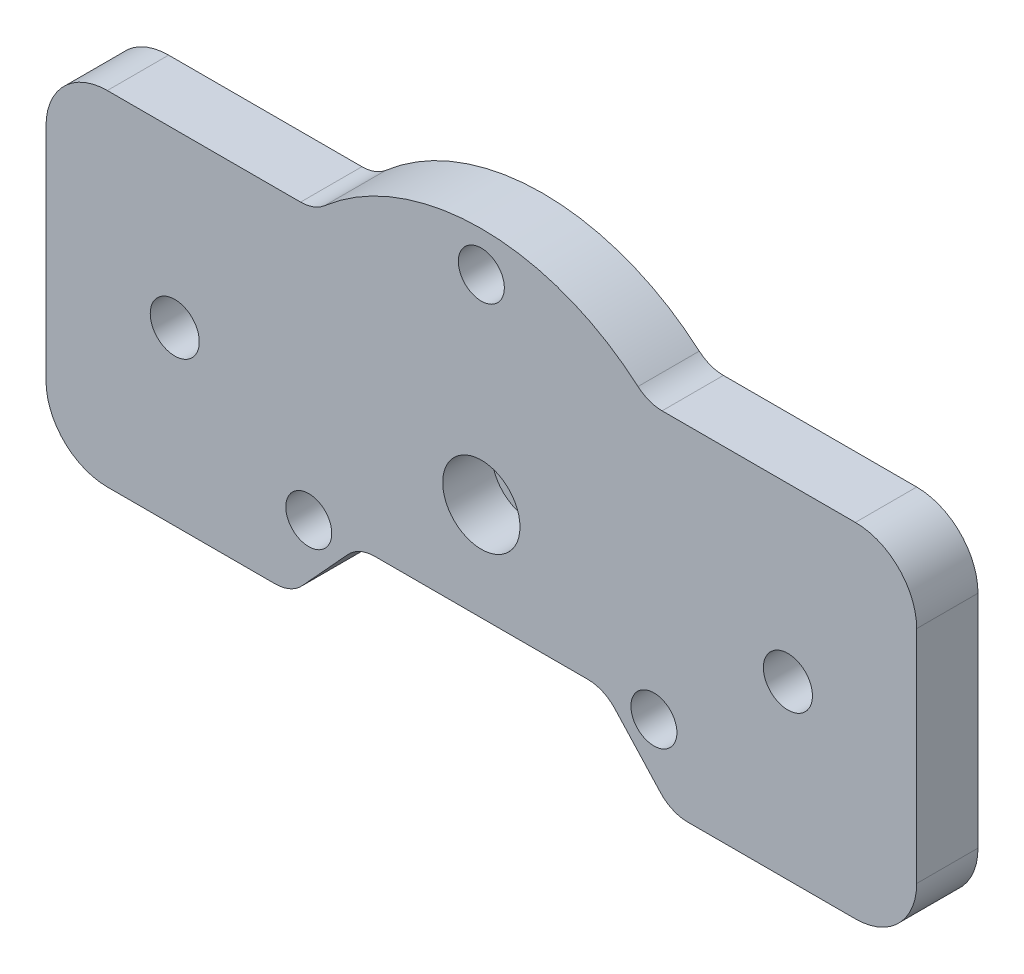
ISO-10303-21;
HEADER;
FILE_DESCRIPTION(('STEP AP214'),'2;1');
FILE_NAME('part.step','',(''),(''),'','','');
FILE_SCHEMA(('AUTOMOTIVE_DESIGN { 1 0 10303 214 1 1 1 1 }'));
ENDSEC;
DATA;
#1=APPLICATION_CONTEXT('core data for automotive mechanical design processes');
#2=APPLICATION_PROTOCOL_DEFINITION('international standard','automotive_design',2000,#1);
#3=PRODUCT_CONTEXT('',#1,'mechanical');
#4=PRODUCT('Part','Part','',(#3));
#5=PRODUCT_RELATED_PRODUCT_CATEGORY('part','',(#4));
#6=PRODUCT_DEFINITION_FORMATION('','',#4);
#7=PRODUCT_DEFINITION_CONTEXT('part definition',#1,'design');
#8=PRODUCT_DEFINITION('design','',#6,#7);
#9=PRODUCT_DEFINITION_SHAPE('','',#8);
#10=(LENGTH_UNIT() NAMED_UNIT(*) SI_UNIT(.MILLI.,.METRE.));
#11=(NAMED_UNIT(*) PLANE_ANGLE_UNIT() SI_UNIT($,.RADIAN.));
#12=(NAMED_UNIT(*) SI_UNIT($,.STERADIAN.) SOLID_ANGLE_UNIT());
#13=UNCERTAINTY_MEASURE_WITH_UNIT(LENGTH_MEASURE(1.E-05),#10,'distance_accuracy_value','');
#14=(GEOMETRIC_REPRESENTATION_CONTEXT(3) GLOBAL_UNCERTAINTY_ASSIGNED_CONTEXT((#13)) GLOBAL_UNIT_ASSIGNED_CONTEXT((#10,
#11,#12)) REPRESENTATION_CONTEXT('',''));
#15=CARTESIAN_POINT('',(0.,0.,0.));
#16=DIRECTION('',(0.,0.,1.));
#17=DIRECTION('',(1.,0.,0.));
#18=AXIS2_PLACEMENT_3D('',#15,#16,#17);
#19=CARTESIAN_POINT('',(35.5,14.,5.));
#20=DIRECTION('',(0.,0.,-1.));
#21=DIRECTION('',(-1.,0.,0.));
#22=AXIS2_PLACEMENT_3D('',#19,#20,#21);
#23=CYLINDRICAL_SURFACE('',#22,1.25);
#24=CARTESIAN_POINT('',(35.5,14.,0.));
#25=DIRECTION('',(0.,0.,1.));
#26=DIRECTION('',(1.,0.,0.));
#27=AXIS2_PLACEMENT_3D('',#24,#25,#26);
#28=CIRCLE('',#27,1.25);
#29=CARTESIAN_POINT('',(36.75,14.,0.));
#30=VERTEX_POINT('',#29);
#31=EDGE_CURVE('E351',#30,#30,#28,.T.);
#32=ORIENTED_EDGE('',*,*,#31,.F.);
#33=EDGE_LOOP('',(#32));
#34=FACE_BOUND('',#33,.T.);
#35=CARTESIAN_POINT('',(35.5,14.,1.));
#36=DIRECTION('',(0.,0.,1.));
#37=DIRECTION('',(1.,0.,0.));
#38=AXIS2_PLACEMENT_3D('',#35,#36,#37);
#39=CIRCLE('',#38,1.25);
#40=CARTESIAN_POINT('',(36.75,14.,1.));
#41=VERTEX_POINT('',#40);
#42=EDGE_CURVE('E38',#41,#41,#39,.T.);
#43=ORIENTED_EDGE('',*,*,#42,.T.);
#44=EDGE_LOOP('',(#43));
#45=FACE_BOUND('',#44,.T.);
#46=ADVANCED_FACE('F34',(#34,#45),#23,.F.);
#47=CARTESIAN_POINT('',(35.5,14.,5.));
#48=DIRECTION('',(0.,0.,1.));
#49=DIRECTION('',(1.,0.,0.));
#50=AXIS2_PLACEMENT_3D('',#47,#48,#49);
#51=PLANE('',#50);
#52=CARTESIAN_POINT('',(60.5,14.,5.));
#53=DIRECTION('',(0.,0.,-1.));
#54=DIRECTION('',(-1.,0.,0.));
#55=AXIS2_PLACEMENT_3D('',#52,#53,#54);
#56=CIRCLE('',#55,2.);
#57=CARTESIAN_POINT('',(58.5,14.,5.));
#58=VERTEX_POINT('',#57);
#59=EDGE_CURVE('E668',#58,#58,#56,.T.);
#60=ORIENTED_EDGE('',*,*,#59,.T.);
#61=EDGE_LOOP('',(#60));
#62=FACE_BOUND('',#61,.T.);
#63=CARTESIAN_POINT('',(10.5,14.,5.));
#64=DIRECTION('',(0.,0.,-1.));
#65=DIRECTION('',(-1.,0.,0.));
#66=AXIS2_PLACEMENT_3D('',#63,#64,#65);
#67=CIRCLE('',#66,2.);
#68=CARTESIAN_POINT('',(8.49999999999999,14.,5.));
#69=VERTEX_POINT('',#68);
#70=EDGE_CURVE('E662',#69,#69,#67,.T.);
#71=ORIENTED_EDGE('',*,*,#70,.T.);
#72=EDGE_LOOP('',(#71));
#73=FACE_BOUND('',#72,.T.);
#74=CARTESIAN_POINT('',(35.5,14.,5.));
#75=DIRECTION('',(0.,0.,1.));
#76=DIRECTION('',(1.,0.,0.));
#77=AXIS2_PLACEMENT_3D('',#74,#75,#76);
#78=CIRCLE('',#77,3.15);
#79=CARTESIAN_POINT('',(38.65,14.,5.));
#80=VERTEX_POINT('',#79);
#81=EDGE_CURVE('E659',#80,#80,#78,.T.);
#82=ORIENTED_EDGE('',*,*,#81,.F.);
#83=EDGE_LOOP('',(#82));
#84=FACE_BOUND('',#83,.T.);
#85=CARTESIAN_POINT('',(49.5729128115012,5.87500000000234,5.));
#86=DIRECTION('',(0.,0.,1.));
#87=DIRECTION('',(1.,0.,0.));
#88=AXIS2_PLACEMENT_3D('',#85,#86,#87);
#89=CIRCLE('',#88,1.875);
#90=CARTESIAN_POINT('',(51.4479128115012,5.87500000000234,5.));
#91=VERTEX_POINT('',#90);
#92=EDGE_CURVE('E646',#91,#91,#89,.T.);
#93=ORIENTED_EDGE('',*,*,#92,.F.);
#94=EDGE_LOOP('',(#93));
#95=FACE_BOUND('',#94,.T.);
#96=CARTESIAN_POINT('',(35.5,30.25,5.));
#97=DIRECTION('',(0.,0.,1.));
#98=DIRECTION('',(1.,0.,0.));
#99=AXIS2_PLACEMENT_3D('',#96,#97,#98);
#100=CIRCLE('',#99,1.875);
#101=CARTESIAN_POINT('',(37.375,30.25,5.));
#102=VERTEX_POINT('',#101);
#103=EDGE_CURVE('E342',#102,#102,#100,.T.);
#104=ORIENTED_EDGE('',*,*,#103,.F.);
#105=EDGE_LOOP('',(#104));
#106=FACE_BOUND('',#105,.T.);
#107=DIRECTION('',(0.675331083100614,-0.737514696937052,0.));
#108=VECTOR('',#107,1.);
#109=CARTESIAN_POINT('',(51.,0.,5.));
#110=LINE('',#109,#108);
#111=CARTESIAN_POINT('',(46.3918832894152,5.03242614519366,5.));
#112=VERTEX_POINT('',#111);
#113=CARTESIAN_POINT('',(50.1081167105848,0.974006750698155,5.));
#114=VERTEX_POINT('',#113);
#115=EDGE_CURVE('E361',#112,#114,#110,.T.);
#116=ORIENTED_EDGE('',*,*,#115,.T.);
#117=CARTESIAN_POINT('',(52.3206608013959,3.,5.));
#118=DIRECTION('',(0.,0.,1.));
#119=DIRECTION('',(1.,0.,0.));
#120=AXIS2_PLACEMENT_3D('',#117,#118,#119);
#121=CIRCLE('',#120,3.);
#122=CARTESIAN_POINT('',(52.3206608013959,0.,5.));
#123=VERTEX_POINT('',#122);
#124=EDGE_CURVE('E288',#114,#123,#121,.T.);
#125=ORIENTED_EDGE('',*,*,#124,.T.);
#126=DIRECTION('',(1.,0.,0.));
#127=VECTOR('',#126,1.);
#128=CARTESIAN_POINT('',(51.,0.,5.));
#129=LINE('',#128,#127);
#130=CARTESIAN_POINT('',(66.,0.,5.));
#131=VERTEX_POINT('',#130);
#132=EDGE_CURVE('E363',#123,#131,#129,.T.);
#133=ORIENTED_EDGE('',*,*,#132,.T.);
#134=CARTESIAN_POINT('',(66.,5.,5.));
#135=DIRECTION('',(0.,0.,1.));
#136=DIRECTION('',(1.,0.,0.));
#137=AXIS2_PLACEMENT_3D('',#134,#135,#136);
#138=CIRCLE('',#137,5.);
#139=CARTESIAN_POINT('',(71.,5.,5.));
#140=VERTEX_POINT('',#139);
#141=EDGE_CURVE('E261',#131,#140,#138,.T.);
#142=ORIENTED_EDGE('',*,*,#141,.T.);
#143=DIRECTION('',(0.,1.,0.));
#144=VECTOR('',#143,1.);
#145=CARTESIAN_POINT('',(71.,0.,5.));
#146=LINE('',#145,#144);
#147=CARTESIAN_POINT('',(71.,23.,5.));
#148=VERTEX_POINT('',#147);
#149=EDGE_CURVE('E338',#140,#148,#146,.T.);
#150=ORIENTED_EDGE('',*,*,#149,.T.);
#151=CARTESIAN_POINT('',(66.,23.,5.));
#152=DIRECTION('',(0.,0.,1.));
#153=DIRECTION('',(1.,0.,0.));
#154=AXIS2_PLACEMENT_3D('',#151,#152,#153);
#155=CIRCLE('',#154,5.);
#156=CARTESIAN_POINT('',(66.,28.,5.));
#157=VERTEX_POINT('',#156);
#158=EDGE_CURVE('E259',#148,#157,#155,.T.);
#159=ORIENTED_EDGE('',*,*,#158,.T.);
#160=DIRECTION('',(-1.,0.,0.));
#161=VECTOR('',#160,1.);
#162=CARTESIAN_POINT('',(49.0738719604982,28.,5.));
#163=LINE('',#162,#161);
#164=CARTESIAN_POINT('',(50.2394029729837,28.,5.));
#165=VERTEX_POINT('',#164);
#166=EDGE_CURVE('E333',#157,#165,#163,.T.);
#167=ORIENTED_EDGE('',*,*,#166,.T.);
#168=CARTESIAN_POINT('',(50.2394029729837,31.,5.));
#169=DIRECTION('',(0.,0.,1.));
#170=DIRECTION('',(1.,0.,0.));
#171=AXIS2_PLACEMENT_3D('',#168,#169,#170);
#172=CIRCLE('',#171,3.);
#173=CARTESIAN_POINT('',(48.2741492432525,28.7333333333333,5.));
#174=VERTEX_POINT('',#173);
#175=EDGE_CURVE('E230',#165,#174,#172,.F.);
#176=ORIENTED_EDGE('',*,*,#175,.T.);
#177=CARTESIAN_POINT('',(35.5,14.,5.));
#178=DIRECTION('',(0.,0.,1.));
#179=DIRECTION('',(1.,0.,0.));
#180=AXIS2_PLACEMENT_3D('',#177,#178,#179);
#181=CIRCLE('',#180,19.5);
#182=CARTESIAN_POINT('',(22.7258507567475,28.7333333333333,5.));
#183=VERTEX_POINT('',#182);
#184=EDGE_CURVE('E332',#174,#183,#181,.T.);
#185=ORIENTED_EDGE('',*,*,#184,.T.);
#186=CARTESIAN_POINT('',(20.7605970270163,31.,5.));
#187=DIRECTION('',(0.,0.,1.));
#188=DIRECTION('',(1.,0.,0.));
#189=AXIS2_PLACEMENT_3D('',#186,#187,#188);
#190=CIRCLE('',#189,3.);
#191=CARTESIAN_POINT('',(20.7605970270163,28.,5.));
#192=VERTEX_POINT('',#191);
#193=EDGE_CURVE('E182',#183,#192,#190,.F.);
#194=ORIENTED_EDGE('',*,*,#193,.T.);
#195=DIRECTION('',(-1.,0.,0.));
#196=VECTOR('',#195,1.);
#197=CARTESIAN_POINT('',(0.,28.,5.));
#198=LINE('',#197,#196);
#199=CARTESIAN_POINT('',(5.,28.,5.));
#200=VERTEX_POINT('',#199);
#201=EDGE_CURVE('E192',#192,#200,#198,.T.);
#202=ORIENTED_EDGE('',*,*,#201,.T.);
#203=CARTESIAN_POINT('',(5.,23.,5.));
#204=DIRECTION('',(0.,0.,1.));
#205=DIRECTION('',(1.,0.,0.));
#206=AXIS2_PLACEMENT_3D('',#203,#204,#205);
#207=CIRCLE('',#206,5.);
#208=CARTESIAN_POINT('',(0.,23.,5.));
#209=VERTEX_POINT('',#208);
#210=EDGE_CURVE('E257',#200,#209,#207,.T.);
#211=ORIENTED_EDGE('',*,*,#210,.T.);
#212=DIRECTION('',(0.,-1.,0.));
#213=VECTOR('',#212,1.);
#214=CARTESIAN_POINT('',(0.,0.,5.));
#215=LINE('',#214,#213);
#216=CARTESIAN_POINT('',(0.,5.,5.));
#217=VERTEX_POINT('',#216);
#218=EDGE_CURVE('E200',#209,#217,#215,.T.);
#219=ORIENTED_EDGE('',*,*,#218,.T.);
#220=CARTESIAN_POINT('',(5.,5.,5.));
#221=DIRECTION('',(0.,0.,1.));
#222=DIRECTION('',(1.,0.,0.));
#223=AXIS2_PLACEMENT_3D('',#220,#221,#222);
#224=CIRCLE('',#223,5.);
#225=CARTESIAN_POINT('',(5.,0.,5.));
#226=VERTEX_POINT('',#225);
#227=EDGE_CURVE('E263',#217,#226,#224,.T.);
#228=ORIENTED_EDGE('',*,*,#227,.T.);
#229=DIRECTION('',(1.,0.,0.));
#230=VECTOR('',#229,1.);
#231=CARTESIAN_POINT('',(0.,0.,5.));
#232=LINE('',#231,#230);
#233=CARTESIAN_POINT('',(18.6793391986041,0.,5.));
#234=VERTEX_POINT('',#233);
#235=EDGE_CURVE('E204',#226,#234,#232,.T.);
#236=ORIENTED_EDGE('',*,*,#235,.T.);
#237=CARTESIAN_POINT('',(18.6793391986041,3.,5.));
#238=DIRECTION('',(0.,0.,1.));
#239=DIRECTION('',(1.,0.,0.));
#240=AXIS2_PLACEMENT_3D('',#237,#238,#239);
#241=CIRCLE('',#240,3.);
#242=CARTESIAN_POINT('',(20.8918832894152,0.974006750698157,5.));
#243=VERTEX_POINT('',#242);
#244=EDGE_CURVE('E50',#234,#243,#241,.T.);
#245=ORIENTED_EDGE('',*,*,#244,.T.);
#246=DIRECTION('',(0.675331083100615,0.737514696937051,0.));
#247=VECTOR('',#246,1.);
#248=CARTESIAN_POINT('',(25.5,6.00643289589181,5.));
#249=LINE('',#248,#247);
#250=CARTESIAN_POINT('',(24.6081167105848,5.03242614519366,5.));
#251=VERTEX_POINT('',#250);
#252=EDGE_CURVE('E296',#243,#251,#249,.T.);
#253=ORIENTED_EDGE('',*,*,#252,.T.);
#254=CARTESIAN_POINT('',(26.8206608013959,3.00643289589181,5.));
#255=DIRECTION('',(0.,0.,1.));
#256=DIRECTION('',(1.,0.,0.));
#257=AXIS2_PLACEMENT_3D('',#254,#255,#256);
#258=CIRCLE('',#257,3.);
#259=CARTESIAN_POINT('',(26.8206608013959,6.00643289589181,5.));
#260=VERTEX_POINT('',#259);
#261=EDGE_CURVE('E239',#251,#260,#258,.F.);
#262=ORIENTED_EDGE('',*,*,#261,.T.);
#263=DIRECTION('',(1.,0.,0.));
#264=VECTOR('',#263,1.);
#265=CARTESIAN_POINT('',(45.5,6.00643289589181,5.));
#266=LINE('',#265,#264);
#267=CARTESIAN_POINT('',(44.1793391986041,6.00643289589181,5.));
#268=VERTEX_POINT('',#267);
#269=EDGE_CURVE('E358',#260,#268,#266,.T.);
#270=ORIENTED_EDGE('',*,*,#269,.T.);
#271=CARTESIAN_POINT('',(44.1793391986041,3.00643289589181,5.));
#272=DIRECTION('',(0.,0.,1.));
#273=DIRECTION('',(1.,0.,0.));
#274=AXIS2_PLACEMENT_3D('',#271,#272,#273);
#275=CIRCLE('',#274,3.);
#276=EDGE_CURVE('E234',#268,#112,#275,.F.);
#277=ORIENTED_EDGE('',*,*,#276,.T.);
#278=EDGE_LOOP('',(#116,#125,#133,#142,#150,#159,#167,#176,#185,#194,#202,#211,#219,#228,#236,
#245,#253,#262,#270,#277));
#279=FACE_BOUND('',#278,.T.);
#280=CARTESIAN_POINT('',(21.4270871885069,5.87499999999773,5.));
#281=DIRECTION('',(0.,0.,1.));
#282=DIRECTION('',(1.,0.,0.));
#283=AXIS2_PLACEMENT_3D('',#280,#281,#282);
#284=CIRCLE('',#283,1.875);
#285=CARTESIAN_POINT('',(23.302087188507,5.87499999999773,5.));
#286=VERTEX_POINT('',#285);
#287=EDGE_CURVE('E634',#286,#286,#284,.T.);
#288=ORIENTED_EDGE('',*,*,#287,.F.);
#289=EDGE_LOOP('',(#288));
#290=FACE_BOUND('',#289,.T.);
#291=ADVANCED_FACE('F330',(#62,#73,#84,#95,#106,#279,#290),#51,.T.);
#292=CARTESIAN_POINT('',(35.5,14.,0.));
#293=DIRECTION('',(0.,0.,1.));
#294=DIRECTION('',(1.,0.,0.));
#295=AXIS2_PLACEMENT_3D('',#292,#293,#294);
#296=PLANE('',#295);
#297=CARTESIAN_POINT('',(60.5,14.,0.));
#298=DIRECTION('',(0.,0.,-1.));
#299=DIRECTION('',(-1.,0.,0.));
#300=AXIS2_PLACEMENT_3D('',#297,#298,#299);
#301=CIRCLE('',#300,2.);
#302=CARTESIAN_POINT('',(58.5,14.,0.));
#303=VERTEX_POINT('',#302);
#304=EDGE_CURVE('E671',#303,#303,#301,.T.);
#305=ORIENTED_EDGE('',*,*,#304,.F.);
#306=EDGE_LOOP('',(#305));
#307=FACE_BOUND('',#306,.T.);
#308=CARTESIAN_POINT('',(10.5,14.,0.));
#309=DIRECTION('',(0.,0.,-1.));
#310=DIRECTION('',(-1.,0.,0.));
#311=AXIS2_PLACEMENT_3D('',#308,#309,#310);
#312=CIRCLE('',#311,2.);
#313=CARTESIAN_POINT('',(8.49999999999999,14.,0.));
#314=VERTEX_POINT('',#313);
#315=EDGE_CURVE('E665',#314,#314,#312,.T.);
#316=ORIENTED_EDGE('',*,*,#315,.F.);
#317=EDGE_LOOP('',(#316));
#318=FACE_BOUND('',#317,.T.);
#319=CARTESIAN_POINT('',(49.5729128115012,5.87500000000234,0.));
#320=DIRECTION('',(0.,0.,1.));
#321=DIRECTION('',(1.,0.,0.));
#322=AXIS2_PLACEMENT_3D('',#319,#320,#321);
#323=CIRCLE('',#322,1.875);
#324=CARTESIAN_POINT('',(51.4479128115012,5.87500000000234,0.));
#325=VERTEX_POINT('',#324);
#326=EDGE_CURVE('E640',#325,#325,#323,.T.);
#327=ORIENTED_EDGE('',*,*,#326,.T.);
#328=EDGE_LOOP('',(#327));
#329=FACE_BOUND('',#328,.T.);
#330=CARTESIAN_POINT('',(35.5,30.25,0.));
#331=DIRECTION('',(0.,0.,1.));
#332=DIRECTION('',(1.,0.,0.));
#333=AXIS2_PLACEMENT_3D('',#330,#331,#332);
#334=CIRCLE('',#333,1.875);
#335=CARTESIAN_POINT('',(37.375,30.25,0.));
#336=VERTEX_POINT('',#335);
#337=EDGE_CURVE('E346',#336,#336,#334,.T.);
#338=ORIENTED_EDGE('',*,*,#337,.T.);
#339=EDGE_LOOP('',(#338));
#340=FACE_BOUND('',#339,.T.);
#341=DIRECTION('',(1.,0.,0.));
#342=VECTOR('',#341,1.);
#343=CARTESIAN_POINT('',(51.,0.,0.));
#344=LINE('',#343,#342);
#345=CARTESIAN_POINT('',(52.3206608013959,0.,0.));
#346=VERTEX_POINT('',#345);
#347=CARTESIAN_POINT('',(66.,0.,0.));
#348=VERTEX_POINT('',#347);
#349=EDGE_CURVE('E313',#346,#348,#344,.T.);
#350=ORIENTED_EDGE('',*,*,#349,.F.);
#351=CARTESIAN_POINT('',(52.3206608013959,3.,0.));
#352=DIRECTION('',(0.,0.,1.));
#353=DIRECTION('',(1.,0.,0.));
#354=AXIS2_PLACEMENT_3D('',#351,#352,#353);
#355=CIRCLE('',#354,3.);
#356=CARTESIAN_POINT('',(50.1081167105848,0.974006750698155,0.));
#357=VERTEX_POINT('',#356);
#358=EDGE_CURVE('E283',#346,#357,#355,.F.);
#359=ORIENTED_EDGE('',*,*,#358,.T.);
#360=DIRECTION('',(0.675331083100614,-0.737514696937052,0.));
#361=VECTOR('',#360,1.);
#362=CARTESIAN_POINT('',(51.,0.,0.));
#363=LINE('',#362,#361);
#364=CARTESIAN_POINT('',(46.3918832894152,5.03242614519366,0.));
#365=VERTEX_POINT('',#364);
#366=EDGE_CURVE('E305',#365,#357,#363,.T.);
#367=ORIENTED_EDGE('',*,*,#366,.F.);
#368=CARTESIAN_POINT('',(44.1793391986041,3.00643289589181,0.));
#369=DIRECTION('',(0.,0.,1.));
#370=DIRECTION('',(1.,0.,0.));
#371=AXIS2_PLACEMENT_3D('',#368,#369,#370);
#372=CIRCLE('',#371,3.);
#373=CARTESIAN_POINT('',(44.1793391986041,6.00643289589181,0.));
#374=VERTEX_POINT('',#373);
#375=EDGE_CURVE('E232',#365,#374,#372,.T.);
#376=ORIENTED_EDGE('',*,*,#375,.T.);
#377=DIRECTION('',(1.,0.,0.));
#378=VECTOR('',#377,1.);
#379=CARTESIAN_POINT('',(45.5,6.00643289589181,0.));
#380=LINE('',#379,#378);
#381=CARTESIAN_POINT('',(26.8206608013959,6.00643289589181,0.));
#382=VERTEX_POINT('',#381);
#383=EDGE_CURVE('E301',#382,#374,#380,.T.);
#384=ORIENTED_EDGE('',*,*,#383,.F.);
#385=CARTESIAN_POINT('',(26.8206608013959,3.00643289589181,0.));
#386=DIRECTION('',(0.,0.,1.));
#387=DIRECTION('',(1.,0.,0.));
#388=AXIS2_PLACEMENT_3D('',#385,#386,#387);
#389=CIRCLE('',#388,3.);
#390=CARTESIAN_POINT('',(24.6081167105848,5.03242614519366,0.));
#391=VERTEX_POINT('',#390);
#392=EDGE_CURVE('E236',#382,#391,#389,.T.);
#393=ORIENTED_EDGE('',*,*,#392,.T.);
#394=DIRECTION('',(0.675331083100615,0.737514696937051,0.));
#395=VECTOR('',#394,1.);
#396=CARTESIAN_POINT('',(25.5,6.00643289589181,0.));
#397=LINE('',#396,#395);
#398=CARTESIAN_POINT('',(20.8918832894152,0.974006750698157,0.));
#399=VERTEX_POINT('',#398);
#400=EDGE_CURVE('E295',#399,#391,#397,.T.);
#401=ORIENTED_EDGE('',*,*,#400,.F.);
#402=CARTESIAN_POINT('',(18.6793391986041,3.,0.));
#403=DIRECTION('',(0.,0.,1.));
#404=DIRECTION('',(1.,0.,0.));
#405=AXIS2_PLACEMENT_3D('',#402,#403,#404);
#406=CIRCLE('',#405,3.);
#407=CARTESIAN_POINT('',(18.6793391986041,0.,0.));
#408=VERTEX_POINT('',#407);
#409=EDGE_CURVE('E281',#399,#408,#406,.F.);
#410=ORIENTED_EDGE('',*,*,#409,.T.);
#411=DIRECTION('',(1.,0.,0.));
#412=VECTOR('',#411,1.);
#413=CARTESIAN_POINT('',(0.,0.,0.));
#414=LINE('',#413,#412);
#415=CARTESIAN_POINT('',(5.,0.,0.));
#416=VERTEX_POINT('',#415);
#417=EDGE_CURVE('E302',#416,#408,#414,.T.);
#418=ORIENTED_EDGE('',*,*,#417,.F.);
#419=CARTESIAN_POINT('',(5.,5.,0.));
#420=DIRECTION('',(0.,0.,1.));
#421=DIRECTION('',(1.,0.,0.));
#422=AXIS2_PLACEMENT_3D('',#419,#420,#421);
#423=CIRCLE('',#422,5.);
#424=CARTESIAN_POINT('',(0.,5.,0.));
#425=VERTEX_POINT('',#424);
#426=EDGE_CURVE('E250',#416,#425,#423,.F.);
#427=ORIENTED_EDGE('',*,*,#426,.T.);
#428=DIRECTION('',(0.,-1.,0.));
#429=VECTOR('',#428,1.);
#430=CARTESIAN_POINT('',(0.,0.,0.));
#431=LINE('',#430,#429);
#432=CARTESIAN_POINT('',(0.,23.,0.));
#433=VERTEX_POINT('',#432);
#434=EDGE_CURVE('E307',#433,#425,#431,.T.);
#435=ORIENTED_EDGE('',*,*,#434,.F.);
#436=CARTESIAN_POINT('',(5.,23.,0.));
#437=DIRECTION('',(0.,0.,1.));
#438=DIRECTION('',(1.,0.,0.));
#439=AXIS2_PLACEMENT_3D('',#436,#437,#438);
#440=CIRCLE('',#439,5.);
#441=CARTESIAN_POINT('',(5.,28.,0.));
#442=VERTEX_POINT('',#441);
#443=EDGE_CURVE('E199',#433,#442,#440,.F.);
#444=ORIENTED_EDGE('',*,*,#443,.T.);
#445=DIRECTION('',(-1.,0.,0.));
#446=VECTOR('',#445,1.);
#447=CARTESIAN_POINT('',(0.,28.,0.));
#448=LINE('',#447,#446);
#449=CARTESIAN_POINT('',(20.7605970270163,28.,0.));
#450=VERTEX_POINT('',#449);
#451=EDGE_CURVE('E189',#450,#442,#448,.T.);
#452=ORIENTED_EDGE('',*,*,#451,.F.);
#453=CARTESIAN_POINT('',(20.7605970270163,31.,0.));
#454=DIRECTION('',(0.,0.,1.));
#455=DIRECTION('',(1.,0.,0.));
#456=AXIS2_PLACEMENT_3D('',#453,#454,#455);
#457=CIRCLE('',#456,3.);
#458=CARTESIAN_POINT('',(22.7258507567475,28.7333333333333,0.));
#459=VERTEX_POINT('',#458);
#460=EDGE_CURVE('E172',#450,#459,#457,.T.);
#461=ORIENTED_EDGE('',*,*,#460,.T.);
#462=CARTESIAN_POINT('',(35.5,14.,0.));
#463=DIRECTION('',(0.,0.,1.));
#464=DIRECTION('',(1.,0.,0.));
#465=AXIS2_PLACEMENT_3D('',#462,#463,#464);
#466=CIRCLE('',#465,19.5);
#467=CARTESIAN_POINT('',(48.2741492432525,28.7333333333333,0.));
#468=VERTEX_POINT('',#467);
#469=EDGE_CURVE('E201',#468,#459,#466,.T.);
#470=ORIENTED_EDGE('',*,*,#469,.F.);
#471=CARTESIAN_POINT('',(50.2394029729837,31.,0.));
#472=DIRECTION('',(0.,0.,1.));
#473=DIRECTION('',(1.,0.,0.));
#474=AXIS2_PLACEMENT_3D('',#471,#472,#473);
#475=CIRCLE('',#474,3.);
#476=CARTESIAN_POINT('',(50.2394029729837,28.,0.));
#477=VERTEX_POINT('',#476);
#478=EDGE_CURVE('E227',#468,#477,#475,.T.);
#479=ORIENTED_EDGE('',*,*,#478,.T.);
#480=DIRECTION('',(-1.,0.,0.));
#481=VECTOR('',#480,1.);
#482=CARTESIAN_POINT('',(49.0738719604982,28.,0.));
#483=LINE('',#482,#481);
#484=CARTESIAN_POINT('',(66.,28.,0.));
#485=VERTEX_POINT('',#484);
#486=EDGE_CURVE('E206',#485,#477,#483,.T.);
#487=ORIENTED_EDGE('',*,*,#486,.F.);
#488=CARTESIAN_POINT('',(66.,23.,0.));
#489=DIRECTION('',(0.,0.,1.));
#490=DIRECTION('',(1.,0.,0.));
#491=AXIS2_PLACEMENT_3D('',#488,#489,#490);
#492=CIRCLE('',#491,5.);
#493=CARTESIAN_POINT('',(71.,23.,0.));
#494=VERTEX_POINT('',#493);
#495=EDGE_CURVE('E245',#485,#494,#492,.F.);
#496=ORIENTED_EDGE('',*,*,#495,.T.);
#497=DIRECTION('',(0.,1.,0.));
#498=VECTOR('',#497,1.);
#499=CARTESIAN_POINT('',(71.,0.,0.));
#500=LINE('',#499,#498);
#501=CARTESIAN_POINT('',(71.,5.,0.));
#502=VERTEX_POINT('',#501);
#503=EDGE_CURVE('E315',#502,#494,#500,.T.);
#504=ORIENTED_EDGE('',*,*,#503,.F.);
#505=CARTESIAN_POINT('',(66.,5.,0.));
#506=DIRECTION('',(0.,0.,1.));
#507=DIRECTION('',(1.,0.,0.));
#508=AXIS2_PLACEMENT_3D('',#505,#506,#507);
#509=CIRCLE('',#508,5.);
#510=EDGE_CURVE('E247',#502,#348,#509,.F.);
#511=ORIENTED_EDGE('',*,*,#510,.T.);
#512=EDGE_LOOP('',(#350,#359,#367,#376,#384,#393,#401,#410,#418,#427,#435,#444,#452,#461,#470,
#479,#487,#496,#504,#511));
#513=FACE_BOUND('',#512,.T.);
#514=ORIENTED_EDGE('',*,*,#31,.T.);
#515=EDGE_LOOP('',(#514));
#516=FACE_BOUND('',#515,.T.);
#517=CARTESIAN_POINT('',(21.4270871885069,5.87499999999773,0.));
#518=DIRECTION('',(0.,0.,1.));
#519=DIRECTION('',(1.,0.,0.));
#520=AXIS2_PLACEMENT_3D('',#517,#518,#519);
#521=CIRCLE('',#520,1.875);
#522=CARTESIAN_POINT('',(23.302087188507,5.87499999999773,0.));
#523=VERTEX_POINT('',#522);
#524=EDGE_CURVE('E637',#523,#523,#521,.T.);
#525=ORIENTED_EDGE('',*,*,#524,.T.);
#526=EDGE_LOOP('',(#525));
#527=FACE_BOUND('',#526,.T.);
#528=ADVANCED_FACE('F196',(#307,#318,#329,#340,#513,#516,#527),#296,.F.);
#529=CARTESIAN_POINT('',(0.,0.,5.));
#530=DIRECTION('',(1.,0.,0.));
#531=DIRECTION('',(0.,0.,-1.));
#532=AXIS2_PLACEMENT_3D('',#529,#530,#531);
#533=PLANE('',#532);
#534=ORIENTED_EDGE('',*,*,#434,.T.);
#535=DIRECTION('',(0.,0.,-1.));
#536=VECTOR('',#535,1.);
#537=CARTESIAN_POINT('',(0.,5.,5.));
#538=LINE('',#537,#536);
#539=EDGE_CURVE('E255',#425,#217,#538,.F.);
#540=ORIENTED_EDGE('',*,*,#539,.T.);
#541=ORIENTED_EDGE('',*,*,#218,.F.);
#542=DIRECTION('',(0.,0.,-1.));
#543=VECTOR('',#542,1.);
#544=CARTESIAN_POINT('',(0.,23.,5.));
#545=LINE('',#544,#543);
#546=EDGE_CURVE('E252',#209,#433,#545,.T.);
#547=ORIENTED_EDGE('',*,*,#546,.T.);
#548=EDGE_LOOP('',(#534,#540,#541,#547));
#549=FACE_BOUND('',#548,.T.);
#550=ADVANCED_FACE('F432',(#549),#533,.F.);
#551=CARTESIAN_POINT('',(0.,0.,5.));
#552=DIRECTION('',(0.,1.,0.));
#553=DIRECTION('',(0.,0.,1.));
#554=AXIS2_PLACEMENT_3D('',#551,#552,#553);
#555=PLANE('',#554);
#556=ORIENTED_EDGE('',*,*,#417,.T.);
#557=DIRECTION('',(0.,0.,-1.));
#558=VECTOR('',#557,1.);
#559=CARTESIAN_POINT('',(18.6793391986041,0.,5.));
#560=LINE('',#559,#558);
#561=EDGE_CURVE('E11',#408,#234,#560,.F.);
#562=ORIENTED_EDGE('',*,*,#561,.T.);
#563=ORIENTED_EDGE('',*,*,#235,.F.);
#564=DIRECTION('',(0.,0.,-1.));
#565=VECTOR('',#564,1.);
#566=CARTESIAN_POINT('',(5.,0.,5.));
#567=LINE('',#566,#565);
#568=EDGE_CURVE('E241',#226,#416,#567,.T.);
#569=ORIENTED_EDGE('',*,*,#568,.T.);
#570=EDGE_LOOP('',(#556,#562,#563,#569));
#571=FACE_BOUND('',#570,.T.);
#572=ADVANCED_FACE('F450',(#571),#555,.F.);
#573=CARTESIAN_POINT('',(25.5,6.00643289589181,5.));
#574=DIRECTION('',(-0.737514696937051,0.675331083100615,0.));
#575=DIRECTION('',(-0.675331083100615,-0.737514696937051,0.));
#576=AXIS2_PLACEMENT_3D('',#573,#574,#575);
#577=PLANE('',#576);
#578=ORIENTED_EDGE('',*,*,#252,.F.);
#579=DIRECTION('',(0.,0.,-1.));
#580=VECTOR('',#579,1.);
#581=CARTESIAN_POINT('',(20.8918832894152,0.974006750698156,5.));
#582=LINE('',#581,#580);
#583=EDGE_CURVE('E43',#243,#399,#582,.T.);
#584=ORIENTED_EDGE('',*,*,#583,.T.);
#585=ORIENTED_EDGE('',*,*,#400,.T.);
#586=DIRECTION('',(0.,0.,-1.));
#587=VECTOR('',#586,1.);
#588=CARTESIAN_POINT('',(24.6081167105848,5.03242614519366,5.));
#589=LINE('',#588,#587);
#590=EDGE_CURVE('E183',#391,#251,#589,.F.);
#591=ORIENTED_EDGE('',*,*,#590,.T.);
#592=EDGE_LOOP('',(#578,#584,#585,#591));
#593=FACE_BOUND('',#592,.T.);
#594=ADVANCED_FACE('F294',(#593),#577,.F.);
#595=CARTESIAN_POINT('',(45.5,6.00643289589181,5.));
#596=DIRECTION('',(0.,1.,0.));
#597=DIRECTION('',(0.,0.,1.));
#598=AXIS2_PLACEMENT_3D('',#595,#596,#597);
#599=PLANE('',#598);
#600=ORIENTED_EDGE('',*,*,#383,.T.);
#601=DIRECTION('',(0.,0.,-1.));
#602=VECTOR('',#601,1.);
#603=CARTESIAN_POINT('',(44.1793391986041,6.00643289589181,5.));
#604=LINE('',#603,#602);
#605=EDGE_CURVE('E222',#374,#268,#604,.F.);
#606=ORIENTED_EDGE('',*,*,#605,.T.);
#607=ORIENTED_EDGE('',*,*,#269,.F.);
#608=DIRECTION('',(0.,0.,-1.));
#609=VECTOR('',#608,1.);
#610=CARTESIAN_POINT('',(26.8206608013959,6.00643289589181,0.));
#611=LINE('',#610,#609);
#612=EDGE_CURVE('E219',#260,#382,#611,.T.);
#613=ORIENTED_EDGE('',*,*,#612,.T.);
#614=EDGE_LOOP('',(#600,#606,#607,#613));
#615=FACE_BOUND('',#614,.T.);
#616=ADVANCED_FACE('F397',(#615),#599,.F.);
#617=CARTESIAN_POINT('',(51.,0.,5.));
#618=DIRECTION('',(0.737514696937052,0.675331083100614,0.));
#619=DIRECTION('',(-0.675331083100614,0.737514696937052,0.));
#620=AXIS2_PLACEMENT_3D('',#617,#618,#619);
#621=PLANE('',#620);
#622=ORIENTED_EDGE('',*,*,#366,.T.);
#623=DIRECTION('',(0.,0.,-1.));
#624=VECTOR('',#623,1.);
#625=CARTESIAN_POINT('',(50.1081167105848,0.974006750698155,5.));
#626=LINE('',#625,#624);
#627=EDGE_CURVE('E285',#357,#114,#626,.F.);
#628=ORIENTED_EDGE('',*,*,#627,.T.);
#629=ORIENTED_EDGE('',*,*,#115,.F.);
#630=DIRECTION('',(0.,0.,-1.));
#631=VECTOR('',#630,1.);
#632=CARTESIAN_POINT('',(46.3918832894152,5.03242614519366,0.));
#633=LINE('',#632,#631);
#634=EDGE_CURVE('E216',#112,#365,#633,.T.);
#635=ORIENTED_EDGE('',*,*,#634,.T.);
#636=EDGE_LOOP('',(#622,#628,#629,#635));
#637=FACE_BOUND('',#636,.T.);
#638=ADVANCED_FACE('F389',(#637),#621,.F.);
#639=CARTESIAN_POINT('',(51.,0.,5.));
#640=DIRECTION('',(0.,1.,0.));
#641=DIRECTION('',(0.,0.,1.));
#642=AXIS2_PLACEMENT_3D('',#639,#640,#641);
#643=PLANE('',#642);
#644=ORIENTED_EDGE('',*,*,#132,.F.);
#645=DIRECTION('',(0.,0.,-1.));
#646=VECTOR('',#645,1.);
#647=CARTESIAN_POINT('',(52.3206608013959,0.,5.));
#648=LINE('',#647,#646);
#649=EDGE_CURVE('E278',#123,#346,#648,.T.);
#650=ORIENTED_EDGE('',*,*,#649,.T.);
#651=ORIENTED_EDGE('',*,*,#349,.T.);
#652=DIRECTION('',(0.,0.,-1.));
#653=VECTOR('',#652,1.);
#654=CARTESIAN_POINT('',(66.,0.,5.));
#655=LINE('',#654,#653);
#656=EDGE_CURVE('E270',#348,#131,#655,.F.);
#657=ORIENTED_EDGE('',*,*,#656,.T.);
#658=EDGE_LOOP('',(#644,#650,#651,#657));
#659=FACE_BOUND('',#658,.T.);
#660=ADVANCED_FACE('F381',(#659),#643,.F.);
#661=CARTESIAN_POINT('',(71.,0.,5.));
#662=DIRECTION('',(-1.,0.,0.));
#663=DIRECTION('',(0.,0.,1.));
#664=AXIS2_PLACEMENT_3D('',#661,#662,#663);
#665=PLANE('',#664);
#666=ORIENTED_EDGE('',*,*,#149,.F.);
#667=DIRECTION('',(0.,0.,-1.));
#668=VECTOR('',#667,1.);
#669=CARTESIAN_POINT('',(71.,5.,5.));
#670=LINE('',#669,#668);
#671=EDGE_CURVE('E267',#140,#502,#670,.T.);
#672=ORIENTED_EDGE('',*,*,#671,.T.);
#673=ORIENTED_EDGE('',*,*,#503,.T.);
#674=DIRECTION('',(0.,0.,-1.));
#675=VECTOR('',#674,1.);
#676=CARTESIAN_POINT('',(71.,23.,5.));
#677=LINE('',#676,#675);
#678=EDGE_CURVE('E265',#494,#148,#677,.F.);
#679=ORIENTED_EDGE('',*,*,#678,.T.);
#680=EDGE_LOOP('',(#666,#672,#673,#679));
#681=FACE_BOUND('',#680,.T.);
#682=ADVANCED_FACE('F374',(#681),#665,.F.);
#683=CARTESIAN_POINT('',(49.0738719604982,28.,5.));
#684=DIRECTION('',(0.,-1.,0.));
#685=DIRECTION('',(0.,0.,-1.));
#686=AXIS2_PLACEMENT_3D('',#683,#684,#685);
#687=PLANE('',#686);
#688=ORIENTED_EDGE('',*,*,#166,.F.);
#689=DIRECTION('',(0.,0.,-1.));
#690=VECTOR('',#689,1.);
#691=CARTESIAN_POINT('',(66.,28.,5.));
#692=LINE('',#691,#690);
#693=EDGE_CURVE('E273',#157,#485,#692,.T.);
#694=ORIENTED_EDGE('',*,*,#693,.T.);
#695=ORIENTED_EDGE('',*,*,#486,.T.);
#696=DIRECTION('',(0.,0.,1.));
#697=VECTOR('',#696,1.);
#698=CARTESIAN_POINT('',(50.2394029729837,28.,5.));
#699=LINE('',#698,#697);
#700=EDGE_CURVE('E213',#477,#165,#699,.T.);
#701=ORIENTED_EDGE('',*,*,#700,.T.);
#702=EDGE_LOOP('',(#688,#694,#695,#701));
#703=FACE_BOUND('',#702,.T.);
#704=ADVANCED_FACE('F320',(#703),#687,.F.);
#705=CARTESIAN_POINT('',(35.5,14.,5.));
#706=DIRECTION('',(0.,0.,-1.));
#707=DIRECTION('',(-1.,0.,0.));
#708=AXIS2_PLACEMENT_3D('',#705,#706,#707);
#709=CYLINDRICAL_SURFACE('',#708,19.5);
#710=ORIENTED_EDGE('',*,*,#469,.T.);
#711=DIRECTION('',(0.,0.,-1.));
#712=VECTOR('',#711,1.);
#713=CARTESIAN_POINT('',(22.7258507567475,28.7333333333333,5.));
#714=LINE('',#713,#712);
#715=EDGE_CURVE('E177',#459,#183,#714,.F.);
#716=ORIENTED_EDGE('',*,*,#715,.T.);
#717=ORIENTED_EDGE('',*,*,#184,.F.);
#718=DIRECTION('',(0.,0.,-1.));
#719=VECTOR('',#718,1.);
#720=CARTESIAN_POINT('',(48.2741492432525,28.7333333333333,5.));
#721=LINE('',#720,#719);
#722=EDGE_CURVE('E193',#174,#468,#721,.T.);
#723=ORIENTED_EDGE('',*,*,#722,.T.);
#724=EDGE_LOOP('',(#710,#716,#717,#723));
#725=FACE_BOUND('',#724,.T.);
#726=ADVANCED_FACE('F335',(#725),#709,.T.);
#727=CARTESIAN_POINT('',(0.,28.,5.));
#728=DIRECTION('',(0.,-1.,0.));
#729=DIRECTION('',(0.,0.,-1.));
#730=AXIS2_PLACEMENT_3D('',#727,#728,#729);
#731=PLANE('',#730);
#732=ORIENTED_EDGE('',*,*,#451,.T.);
#733=DIRECTION('',(0.,0.,-1.));
#734=VECTOR('',#733,1.);
#735=CARTESIAN_POINT('',(5.,28.,5.));
#736=LINE('',#735,#734);
#737=EDGE_CURVE('E276',#442,#200,#736,.F.);
#738=ORIENTED_EDGE('',*,*,#737,.T.);
#739=ORIENTED_EDGE('',*,*,#201,.F.);
#740=DIRECTION('',(0.,0.,1.));
#741=VECTOR('',#740,1.);
#742=CARTESIAN_POINT('',(20.7605970270163,28.,0.));
#743=LINE('',#742,#741);
#744=EDGE_CURVE('E176',#192,#450,#743,.F.);
#745=ORIENTED_EDGE('',*,*,#744,.T.);
#746=EDGE_LOOP('',(#732,#738,#739,#745));
#747=FACE_BOUND('',#746,.T.);
#748=ADVANCED_FACE('F188',(#747),#731,.F.);
#749=CARTESIAN_POINT('',(35.5,30.25,5.));
#750=DIRECTION('',(0.,0.,-1.));
#751=DIRECTION('',(-1.,0.,0.));
#752=AXIS2_PLACEMENT_3D('',#749,#750,#751);
#753=CYLINDRICAL_SURFACE('',#752,1.875);
#754=ORIENTED_EDGE('',*,*,#103,.T.);
#755=EDGE_LOOP('',(#754));
#756=FACE_BOUND('',#755,.T.);
#757=ORIENTED_EDGE('',*,*,#337,.F.);
#758=EDGE_LOOP('',(#757));
#759=FACE_BOUND('',#758,.T.);
#760=ADVANCED_FACE('F427',(#756,#759),#753,.F.);
#761=CARTESIAN_POINT('',(49.5729128115012,5.87500000000234,5.));
#762=DIRECTION('',(0.,0.,-1.));
#763=DIRECTION('',(-1.,0.,0.));
#764=AXIS2_PLACEMENT_3D('',#761,#762,#763);
#765=CYLINDRICAL_SURFACE('',#764,1.875);
#766=ORIENTED_EDGE('',*,*,#92,.T.);
#767=EDGE_LOOP('',(#766));
#768=FACE_BOUND('',#767,.T.);
#769=ORIENTED_EDGE('',*,*,#326,.F.);
#770=EDGE_LOOP('',(#769));
#771=FACE_BOUND('',#770,.T.);
#772=ADVANCED_FACE('F425',(#768,#771),#765,.F.);
#773=CARTESIAN_POINT('',(21.4270871885069,5.87499999999773,5.));
#774=DIRECTION('',(0.,0.,-1.));
#775=DIRECTION('',(-1.,0.,0.));
#776=AXIS2_PLACEMENT_3D('',#773,#774,#775);
#777=CYLINDRICAL_SURFACE('',#776,1.875);
#778=ORIENTED_EDGE('',*,*,#287,.T.);
#779=EDGE_LOOP('',(#778));
#780=FACE_BOUND('',#779,.T.);
#781=ORIENTED_EDGE('',*,*,#524,.F.);
#782=EDGE_LOOP('',(#781));
#783=FACE_BOUND('',#782,.T.);
#784=ADVANCED_FACE('F457',(#780,#783),#777,.F.);
#785=CARTESIAN_POINT('',(20.7605970270163,31.,5.));
#786=DIRECTION('',(0.,0.,-1.));
#787=DIRECTION('',(-1.,0.,0.));
#788=AXIS2_PLACEMENT_3D('',#785,#786,#787);
#789=CYLINDRICAL_SURFACE('',#788,3.);
#790=ORIENTED_EDGE('',*,*,#193,.F.);
#791=ORIENTED_EDGE('',*,*,#715,.F.);
#792=ORIENTED_EDGE('',*,*,#460,.F.);
#793=ORIENTED_EDGE('',*,*,#744,.F.);
#794=EDGE_LOOP('',(#790,#791,#792,#793));
#795=FACE_BOUND('',#794,.T.);
#796=ADVANCED_FACE('F175',(#795),#789,.F.);
#797=CARTESIAN_POINT('',(50.2394029729837,31.,5.));
#798=DIRECTION('',(0.,0.,-1.));
#799=DIRECTION('',(-1.,0.,0.));
#800=AXIS2_PLACEMENT_3D('',#797,#798,#799);
#801=CYLINDRICAL_SURFACE('',#800,3.);
#802=ORIENTED_EDGE('',*,*,#175,.F.);
#803=ORIENTED_EDGE('',*,*,#700,.F.);
#804=ORIENTED_EDGE('',*,*,#478,.F.);
#805=ORIENTED_EDGE('',*,*,#722,.F.);
#806=EDGE_LOOP('',(#802,#803,#804,#805));
#807=FACE_BOUND('',#806,.T.);
#808=ADVANCED_FACE('F326',(#807),#801,.F.);
#809=CARTESIAN_POINT('',(44.1793391986041,3.00643289589181,5.));
#810=DIRECTION('',(0.,0.,1.));
#811=DIRECTION('',(1.,0.,0.));
#812=AXIS2_PLACEMENT_3D('',#809,#810,#811);
#813=CYLINDRICAL_SURFACE('',#812,3.);
#814=ORIENTED_EDGE('',*,*,#276,.F.);
#815=ORIENTED_EDGE('',*,*,#605,.F.);
#816=ORIENTED_EDGE('',*,*,#375,.F.);
#817=ORIENTED_EDGE('',*,*,#634,.F.);
#818=EDGE_LOOP('',(#814,#815,#816,#817));
#819=FACE_BOUND('',#818,.T.);
#820=ADVANCED_FACE('F395',(#819),#813,.F.);
#821=CARTESIAN_POINT('',(26.8206608013959,3.00643289589181,5.));
#822=DIRECTION('',(0.,0.,1.));
#823=DIRECTION('',(1.,0.,0.));
#824=AXIS2_PLACEMENT_3D('',#821,#822,#823);
#825=CYLINDRICAL_SURFACE('',#824,3.);
#826=ORIENTED_EDGE('',*,*,#261,.F.);
#827=ORIENTED_EDGE('',*,*,#590,.F.);
#828=ORIENTED_EDGE('',*,*,#392,.F.);
#829=ORIENTED_EDGE('',*,*,#612,.F.);
#830=EDGE_LOOP('',(#826,#827,#828,#829));
#831=FACE_BOUND('',#830,.T.);
#832=ADVANCED_FACE('F401',(#831),#825,.F.);
#833=CARTESIAN_POINT('',(5.,5.,5.));
#834=DIRECTION('',(0.,0.,-1.));
#835=DIRECTION('',(-1.,0.,0.));
#836=AXIS2_PLACEMENT_3D('',#833,#834,#835);
#837=CYLINDRICAL_SURFACE('',#836,5.);
#838=ORIENTED_EDGE('',*,*,#227,.F.);
#839=ORIENTED_EDGE('',*,*,#539,.F.);
#840=ORIENTED_EDGE('',*,*,#426,.F.);
#841=ORIENTED_EDGE('',*,*,#568,.F.);
#842=EDGE_LOOP('',(#838,#839,#840,#841));
#843=FACE_BOUND('',#842,.T.);
#844=ADVANCED_FACE('F403',(#843),#837,.T.);
#845=CARTESIAN_POINT('',(66.,5.,5.));
#846=DIRECTION('',(0.,0.,-1.));
#847=DIRECTION('',(-1.,0.,0.));
#848=AXIS2_PLACEMENT_3D('',#845,#846,#847);
#849=CYLINDRICAL_SURFACE('',#848,5.);
#850=ORIENTED_EDGE('',*,*,#141,.F.);
#851=ORIENTED_EDGE('',*,*,#656,.F.);
#852=ORIENTED_EDGE('',*,*,#510,.F.);
#853=ORIENTED_EDGE('',*,*,#671,.F.);
#854=EDGE_LOOP('',(#850,#851,#852,#853));
#855=FACE_BOUND('',#854,.T.);
#856=ADVANCED_FACE('F376',(#855),#849,.T.);
#857=CARTESIAN_POINT('',(66.,23.,5.));
#858=DIRECTION('',(0.,0.,-1.));
#859=DIRECTION('',(-1.,0.,0.));
#860=AXIS2_PLACEMENT_3D('',#857,#858,#859);
#861=CYLINDRICAL_SURFACE('',#860,5.);
#862=ORIENTED_EDGE('',*,*,#158,.F.);
#863=ORIENTED_EDGE('',*,*,#678,.F.);
#864=ORIENTED_EDGE('',*,*,#495,.F.);
#865=ORIENTED_EDGE('',*,*,#693,.F.);
#866=EDGE_LOOP('',(#862,#863,#864,#865));
#867=FACE_BOUND('',#866,.T.);
#868=ADVANCED_FACE('F372',(#867),#861,.T.);
#869=CARTESIAN_POINT('',(5.,23.,5.));
#870=DIRECTION('',(0.,0.,-1.));
#871=DIRECTION('',(-1.,0.,0.));
#872=AXIS2_PLACEMENT_3D('',#869,#870,#871);
#873=CYLINDRICAL_SURFACE('',#872,5.);
#874=ORIENTED_EDGE('',*,*,#210,.F.);
#875=ORIENTED_EDGE('',*,*,#737,.F.);
#876=ORIENTED_EDGE('',*,*,#443,.F.);
#877=ORIENTED_EDGE('',*,*,#546,.F.);
#878=EDGE_LOOP('',(#874,#875,#876,#877));
#879=FACE_BOUND('',#878,.T.);
#880=ADVANCED_FACE('F525',(#879),#873,.T.);
#881=CARTESIAN_POINT('',(52.3206608013959,3.,5.));
#882=DIRECTION('',(0.,0.,-1.));
#883=DIRECTION('',(-1.,0.,0.));
#884=AXIS2_PLACEMENT_3D('',#881,#882,#883);
#885=CYLINDRICAL_SURFACE('',#884,3.);
#886=ORIENTED_EDGE('',*,*,#124,.F.);
#887=ORIENTED_EDGE('',*,*,#627,.F.);
#888=ORIENTED_EDGE('',*,*,#358,.F.);
#889=ORIENTED_EDGE('',*,*,#649,.F.);
#890=EDGE_LOOP('',(#886,#887,#888,#889));
#891=FACE_BOUND('',#890,.T.);
#892=ADVANCED_FACE('F385',(#891),#885,.T.);
#893=CARTESIAN_POINT('',(18.6793391986041,3.,5.));
#894=DIRECTION('',(0.,0.,-1.));
#895=DIRECTION('',(-1.,0.,0.));
#896=AXIS2_PLACEMENT_3D('',#893,#894,#895);
#897=CYLINDRICAL_SURFACE('',#896,3.);
#898=ORIENTED_EDGE('',*,*,#244,.F.);
#899=ORIENTED_EDGE('',*,*,#561,.F.);
#900=ORIENTED_EDGE('',*,*,#409,.F.);
#901=ORIENTED_EDGE('',*,*,#583,.F.);
#902=EDGE_LOOP('',(#898,#899,#900,#901));
#903=FACE_BOUND('',#902,.T.);
#904=ADVANCED_FACE('F36',(#903),#897,.T.);
#905=CARTESIAN_POINT('',(35.5,14.,1.));
#906=DIRECTION('',(0.,0.,1.));
#907=DIRECTION('',(1.,0.,0.));
#908=AXIS2_PLACEMENT_3D('',#905,#906,#907);
#909=CYLINDRICAL_SURFACE('',#908,3.15);
#910=CARTESIAN_POINT('',(35.5,14.,1.));
#911=DIRECTION('',(0.,0.,1.));
#912=DIRECTION('',(1.,0.,0.));
#913=AXIS2_PLACEMENT_3D('',#910,#911,#912);
#914=CIRCLE('',#913,3.15);
#915=CARTESIAN_POINT('',(38.65,14.,1.));
#916=VERTEX_POINT('',#915);
#917=EDGE_CURVE('E643',#916,#916,#914,.T.);
#918=ORIENTED_EDGE('',*,*,#917,.F.);
#919=EDGE_LOOP('',(#918));
#920=FACE_BOUND('',#919,.T.);
#921=ORIENTED_EDGE('',*,*,#81,.T.);
#922=EDGE_LOOP('',(#921));
#923=FACE_BOUND('',#922,.T.);
#924=ADVANCED_FACE('F572',(#920,#923),#909,.F.);
#925=CARTESIAN_POINT('',(35.5,14.,1.));
#926=DIRECTION('',(0.,0.,1.));
#927=DIRECTION('',(1.,0.,0.));
#928=AXIS2_PLACEMENT_3D('',#925,#926,#927);
#929=PLANE('',#928);
#930=ORIENTED_EDGE('',*,*,#42,.F.);
#931=EDGE_LOOP('',(#930));
#932=FACE_BOUND('',#931,.T.);
#933=ORIENTED_EDGE('',*,*,#917,.T.);
#934=EDGE_LOOP('',(#933));
#935=FACE_BOUND('',#934,.T.);
#936=ADVANCED_FACE('F585',(#932,#935),#929,.T.);
#937=CARTESIAN_POINT('',(10.5,14.,5.));
#938=DIRECTION('',(0.,0.,-1.));
#939=DIRECTION('',(-1.,0.,0.));
#940=AXIS2_PLACEMENT_3D('',#937,#938,#939);
#941=CYLINDRICAL_SURFACE('',#940,2.);
#942=ORIENTED_EDGE('',*,*,#70,.F.);
#943=EDGE_LOOP('',(#942));
#944=FACE_BOUND('',#943,.T.);
#945=ORIENTED_EDGE('',*,*,#315,.T.);
#946=EDGE_LOOP('',(#945));
#947=FACE_BOUND('',#946,.T.);
#948=ADVANCED_FACE('F594',(#944,#947),#941,.F.);
#949=CARTESIAN_POINT('',(60.5,14.,5.));
#950=DIRECTION('',(0.,0.,-1.));
#951=DIRECTION('',(-1.,0.,0.));
#952=AXIS2_PLACEMENT_3D('',#949,#950,#951);
#953=CYLINDRICAL_SURFACE('',#952,2.);
#954=ORIENTED_EDGE('',*,*,#59,.F.);
#955=EDGE_LOOP('',(#954));
#956=FACE_BOUND('',#955,.T.);
#957=ORIENTED_EDGE('',*,*,#304,.T.);
#958=EDGE_LOOP('',(#957));
#959=FACE_BOUND('',#958,.T.);
#960=ADVANCED_FACE('F610',(#956,#959),#953,.F.);
#961=CLOSED_SHELL('',(#46,#291,#528,#550,#572,#594,#616,#638,#660,#682,#704,#726,#748,#760,#772,
#784,#796,#808,#820,#832,#844,#856,#868,#880,#892,#904,#924,#936,#948,#960));
#962=MANIFOLD_SOLID_BREP('B2',#961);
#963=ADVANCED_BREP_SHAPE_REPRESENTATION('',(#18,#962),#14);
#964=SHAPE_DEFINITION_REPRESENTATION(#9,#963);
ENDSEC;
END-ISO-10303-21;
